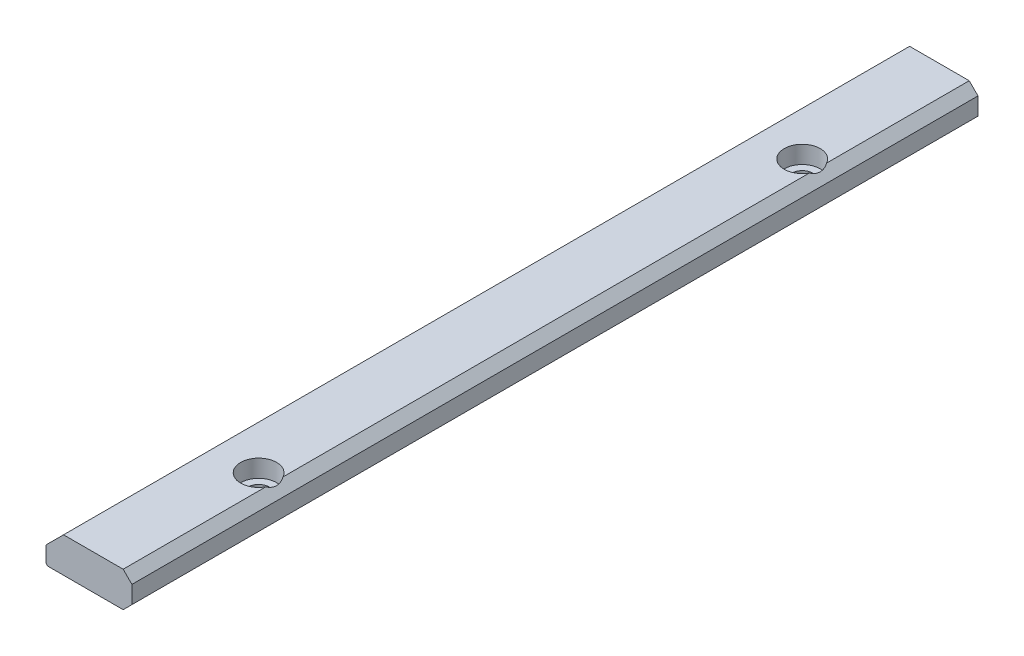
ISO-10303-21;
HEADER;
FILE_DESCRIPTION(('STEP AP214'),'2;1');
FILE_NAME('part.step','',(''),(''),'','','');
FILE_SCHEMA(('AUTOMOTIVE_DESIGN { 1 0 10303 214 1 1 1 1 }'));
ENDSEC;
DATA;
#1=APPLICATION_CONTEXT('core data for automotive mechanical design processes');
#2=APPLICATION_PROTOCOL_DEFINITION('international standard','automotive_design',2000,#1);
#3=PRODUCT_CONTEXT('',#1,'mechanical');
#4=PRODUCT('Part','Part','',(#3));
#5=PRODUCT_RELATED_PRODUCT_CATEGORY('part','',(#4));
#6=PRODUCT_DEFINITION_FORMATION('','',#4);
#7=PRODUCT_DEFINITION_CONTEXT('part definition',#1,'design');
#8=PRODUCT_DEFINITION('design','',#6,#7);
#9=PRODUCT_DEFINITION_SHAPE('','',#8);
#10=(LENGTH_UNIT() NAMED_UNIT(*) SI_UNIT(.MILLI.,.METRE.));
#11=(NAMED_UNIT(*) PLANE_ANGLE_UNIT() SI_UNIT($,.RADIAN.));
#12=(NAMED_UNIT(*) SI_UNIT($,.STERADIAN.) SOLID_ANGLE_UNIT());
#13=UNCERTAINTY_MEASURE_WITH_UNIT(LENGTH_MEASURE(1.E-05),#10,'distance_accuracy_value','');
#14=(GEOMETRIC_REPRESENTATION_CONTEXT(3) GLOBAL_UNCERTAINTY_ASSIGNED_CONTEXT((#13)) GLOBAL_UNIT_ASSIGNED_CONTEXT((#10,
#11,#12)) REPRESENTATION_CONTEXT('',''));
#15=CARTESIAN_POINT('',(0.,0.,0.));
#16=DIRECTION('',(0.,0.,1.));
#17=DIRECTION('',(1.,0.,0.));
#18=AXIS2_PLACEMENT_3D('',#15,#16,#17);
#19=CARTESIAN_POINT('',(0.,0.,-96.5));
#20=DIRECTION('',(0.,0.,-1.));
#21=DIRECTION('',(-1.,0.,0.));
#22=AXIS2_PLACEMENT_3D('',#19,#20,#21);
#23=PLANE('',#22);
#24=DIRECTION('',(1.,0.,0.));
#25=VECTOR('',#24,1.);
#26=CARTESIAN_POINT('',(0.,0.,-96.5));
#27=LINE('',#26,#25);
#28=CARTESIAN_POINT('',(-1.60000000000001,0.,-96.5));
#29=VERTEX_POINT('',#28);
#30=CARTESIAN_POINT('',(6.99999999999997,0.,-96.5));
#31=VERTEX_POINT('',#30);
#32=EDGE_CURVE('E377',#29,#31,#27,.T.);
#33=ORIENTED_EDGE('',*,*,#32,.F.);
#34=DIRECTION('',(0.707106781186548,-0.707106781186548,0.));
#35=VECTOR('',#34,1.);
#36=CARTESIAN_POINT('',(-0.800000000000004,-0.800000000000004,-96.5));
#37=LINE('',#36,#35);
#38=CARTESIAN_POINT('',(-1.8,0.199999999999992,-96.5));
#39=VERTEX_POINT('',#38);
#40=EDGE_CURVE('E283',#29,#39,#37,.F.);
#41=ORIENTED_EDGE('',*,*,#40,.T.);
#42=DIRECTION('',(0.,-1.,0.));
#43=VECTOR('',#42,1.);
#44=CARTESIAN_POINT('',(-1.8,4.,-96.5));
#45=LINE('',#44,#43);
#46=CARTESIAN_POINT('',(-1.8,2.,-96.5));
#47=VERTEX_POINT('',#46);
#48=EDGE_CURVE('E399',#47,#39,#45,.T.);
#49=ORIENTED_EDGE('',*,*,#48,.F.);
#50=DIRECTION('',(-0.707106781186545,-0.70710678118655,0.));
#51=VECTOR('',#50,1.);
#52=CARTESIAN_POINT('',(-1.90000000000001,1.89999999999999,-96.5));
#53=LINE('',#52,#51);
#54=CARTESIAN_POINT('',(0.199999999999988,4.,-96.5));
#55=VERTEX_POINT('',#54);
#56=EDGE_CURVE('E241',#47,#55,#53,.F.);
#57=ORIENTED_EDGE('',*,*,#56,.T.);
#58=DIRECTION('',(-1.,0.,0.));
#59=VECTOR('',#58,1.);
#60=CARTESIAN_POINT('',(0.,4.,-96.5));
#61=LINE('',#60,#59);
#62=CARTESIAN_POINT('',(6.99999999999997,4.,-96.5));
#63=VERTEX_POINT('',#62);
#64=EDGE_CURVE('E391',#63,#55,#61,.T.);
#65=ORIENTED_EDGE('',*,*,#64,.F.);
#66=DIRECTION('',(-0.707106781186548,0.707106781186548,0.));
#67=VECTOR('',#66,1.);
#68=CARTESIAN_POINT('',(5.49999999999999,5.49999999999999,-96.5));
#69=LINE('',#68,#67);
#70=CARTESIAN_POINT('',(8.,2.99999999999997,-96.5));
#71=VERTEX_POINT('',#70);
#72=EDGE_CURVE('E196',#63,#71,#69,.F.);
#73=ORIENTED_EDGE('',*,*,#72,.T.);
#74=DIRECTION('',(0.,1.,0.));
#75=VECTOR('',#74,1.);
#76=CARTESIAN_POINT('',(8.,0.,-96.5));
#77=LINE('',#76,#75);
#78=CARTESIAN_POINT('',(8.,1.00000000000003,-96.5));
#79=VERTEX_POINT('',#78);
#80=EDGE_CURVE('E387',#79,#71,#77,.T.);
#81=ORIENTED_EDGE('',*,*,#80,.F.);
#82=DIRECTION('',(0.707106781186548,0.707106781186548,0.));
#83=VECTOR('',#82,1.);
#84=CARTESIAN_POINT('',(3.49999999999999,-3.49999999999999,-96.5));
#85=LINE('',#84,#83);
#86=EDGE_CURVE('E385',#79,#31,#85,.F.);
#87=ORIENTED_EDGE('',*,*,#86,.T.);
#88=EDGE_LOOP('',(#33,#41,#49,#57,#65,#73,#81,#87));
#89=FACE_BOUND('',#88,.T.);
#90=ADVANCED_FACE('F37',(#89),#23,.T.);
#91=CARTESIAN_POINT('',(0.,0.,0.));
#92=DIRECTION('',(0.,0.,-1.));
#93=DIRECTION('',(-1.,0.,0.));
#94=AXIS2_PLACEMENT_3D('',#91,#92,#93);
#95=PLANE('',#94);
#96=DIRECTION('',(0.,-1.,0.));
#97=VECTOR('',#96,1.);
#98=CARTESIAN_POINT('',(-1.8,4.,0.));
#99=LINE('',#98,#97);
#100=CARTESIAN_POINT('',(-1.8,2.,0.));
#101=VERTEX_POINT('',#100);
#102=CARTESIAN_POINT('',(-1.8,0.199999999999992,0.));
#103=VERTEX_POINT('',#102);
#104=EDGE_CURVE('E388',#101,#103,#99,.T.);
#105=ORIENTED_EDGE('',*,*,#104,.T.);
#106=DIRECTION('',(-0.707106781186548,0.707106781186548,0.));
#107=VECTOR('',#106,1.);
#108=CARTESIAN_POINT('',(-1.8,0.199999999999992,0.));
#109=LINE('',#108,#107);
#110=CARTESIAN_POINT('',(-1.60000000000001,0.,0.));
#111=VERTEX_POINT('',#110);
#112=EDGE_CURVE('E285',#103,#111,#109,.F.);
#113=ORIENTED_EDGE('',*,*,#112,.T.);
#114=DIRECTION('',(1.,0.,0.));
#115=VECTOR('',#114,1.);
#116=CARTESIAN_POINT('',(0.,0.,0.));
#117=LINE('',#116,#115);
#118=CARTESIAN_POINT('',(6.99999999999997,0.,0.));
#119=VERTEX_POINT('',#118);
#120=EDGE_CURVE('E226',#111,#119,#117,.T.);
#121=ORIENTED_EDGE('',*,*,#120,.T.);
#122=DIRECTION('',(-0.707106781186548,-0.707106781186548,0.));
#123=VECTOR('',#122,1.);
#124=CARTESIAN_POINT('',(6.99999999999997,0.,0.));
#125=LINE('',#124,#123);
#126=CARTESIAN_POINT('',(8.,1.00000000000003,0.));
#127=VERTEX_POINT('',#126);
#128=EDGE_CURVE('E410',#119,#127,#125,.F.);
#129=ORIENTED_EDGE('',*,*,#128,.T.);
#130=DIRECTION('',(0.,1.,0.));
#131=VECTOR('',#130,1.);
#132=CARTESIAN_POINT('',(8.,0.,0.));
#133=LINE('',#132,#131);
#134=CARTESIAN_POINT('',(8.,2.99999999999997,0.));
#135=VERTEX_POINT('',#134);
#136=EDGE_CURVE('E402',#127,#135,#133,.T.);
#137=ORIENTED_EDGE('',*,*,#136,.T.);
#138=DIRECTION('',(0.707106781186548,-0.707106781186548,0.));
#139=VECTOR('',#138,1.);
#140=CARTESIAN_POINT('',(8.,2.99999999999997,0.));
#141=LINE('',#140,#139);
#142=CARTESIAN_POINT('',(6.99999999999997,4.,0.));
#143=VERTEX_POINT('',#142);
#144=EDGE_CURVE('E214',#135,#143,#141,.F.);
#145=ORIENTED_EDGE('',*,*,#144,.T.);
#146=DIRECTION('',(-1.,0.,0.));
#147=VECTOR('',#146,1.);
#148=CARTESIAN_POINT('',(0.,4.,0.));
#149=LINE('',#148,#147);
#150=CARTESIAN_POINT('',(0.199999999999988,4.,0.));
#151=VERTEX_POINT('',#150);
#152=EDGE_CURVE('E394',#143,#151,#149,.T.);
#153=ORIENTED_EDGE('',*,*,#152,.T.);
#154=DIRECTION('',(0.707106781186545,0.70710678118655,0.));
#155=VECTOR('',#154,1.);
#156=CARTESIAN_POINT('',(0.199999999999988,4.,0.));
#157=LINE('',#156,#155);
#158=EDGE_CURVE('E237',#151,#101,#157,.F.);
#159=ORIENTED_EDGE('',*,*,#158,.T.);
#160=EDGE_LOOP('',(#105,#113,#121,#129,#137,#145,#153,#159));
#161=FACE_BOUND('',#160,.T.);
#162=ADVANCED_FACE('F420',(#161),#95,.F.);
#163=CARTESIAN_POINT('',(5.20000000000001,4.000012,-79.25));
#164=DIRECTION('',(0.,-1.,0.));
#165=DIRECTION('',(0.,0.,-1.));
#166=AXIS2_PLACEMENT_3D('',#163,#164,#165);
#167=CYLINDRICAL_SURFACE('',#166,1.20000000000001);
#168=CARTESIAN_POINT('',(5.20000000000001,0.,-79.25));
#169=DIRECTION('',(0.,-1.,0.));
#170=DIRECTION('',(0.,0.,-1.));
#171=AXIS2_PLACEMENT_3D('',#168,#169,#170);
#172=CIRCLE('',#171,1.20000000000001);
#173=CARTESIAN_POINT('',(5.20000000000001,0.,-80.45));
#174=VERTEX_POINT('',#173);
#175=EDGE_CURVE('E219',#174,#174,#172,.F.);
#176=CARTESIAN_POINT('',(5.20000000000001,2.,-79.25));
#177=DIRECTION('',(0.,1.,0.));
#178=DIRECTION('',(0.,0.,1.));
#179=AXIS2_PLACEMENT_3D('',#176,#177,#178);
#180=CIRCLE('',#179,1.20000000000001);
#181=CARTESIAN_POINT('',(5.20000000000001,2.,-80.45));
#182=VERTEX_POINT('',#181);
#183=EDGE_CURVE('E223',#182,#182,#180,.T.);
#184=CARTESIAN_POINT('',(5.20000000000001,0.,-80.45));
#185=CARTESIAN_POINT('',(5.20000000000001,0.0208333333333334,-80.45));
#186=CARTESIAN_POINT('',(5.20000000000001,0.0416666666666667,-80.45));
#187=CARTESIAN_POINT('',(5.20000000000001,0.0833333333333333,-80.45));
#188=CARTESIAN_POINT('',(5.20000000000001,0.104166666666666,-80.45));
#189=CARTESIAN_POINT('',(5.20000000000001,0.145833333333333,-80.45));
#190=CARTESIAN_POINT('',(5.20000000000001,0.166666666666666,-80.45));
#191=CARTESIAN_POINT('',(5.20000000000001,0.208333333333333,-80.45));
#192=CARTESIAN_POINT('',(5.20000000000001,0.229166666666666,-80.45));
#193=CARTESIAN_POINT('',(5.20000000000001,0.270833333333333,-80.45));
#194=CARTESIAN_POINT('',(5.20000000000001,0.291666666666666,-80.45));
#195=CARTESIAN_POINT('',(5.20000000000001,0.333333333333333,-80.45));
#196=CARTESIAN_POINT('',(5.20000000000001,0.354166666666666,-80.45));
#197=CARTESIAN_POINT('',(5.20000000000001,0.395833333333333,-80.45));
#198=CARTESIAN_POINT('',(5.20000000000001,0.416666666666666,-80.45));
#199=CARTESIAN_POINT('',(5.20000000000001,0.458333333333333,-80.45));
#200=CARTESIAN_POINT('',(5.20000000000001,0.479166666666666,-80.45));
#201=CARTESIAN_POINT('',(5.20000000000001,0.520833333333333,-80.45));
#202=CARTESIAN_POINT('',(5.20000000000001,0.541666666666666,-80.45));
#203=CARTESIAN_POINT('',(5.20000000000001,0.583333333333333,-80.45));
#204=CARTESIAN_POINT('',(5.20000000000001,0.604166666666666,-80.45));
#205=CARTESIAN_POINT('',(5.20000000000001,0.645833333333333,-80.45));
#206=CARTESIAN_POINT('',(5.20000000000001,0.666666666666666,-80.45));
#207=CARTESIAN_POINT('',(5.20000000000001,0.708333333333333,-80.45));
#208=CARTESIAN_POINT('',(5.20000000000001,0.729166666666666,-80.45));
#209=CARTESIAN_POINT('',(5.20000000000001,0.770833333333333,-80.45));
#210=CARTESIAN_POINT('',(5.20000000000001,0.791666666666666,-80.45));
#211=CARTESIAN_POINT('',(5.20000000000001,0.833333333333333,-80.45));
#212=CARTESIAN_POINT('',(5.20000000000001,0.854166666666666,-80.45));
#213=CARTESIAN_POINT('',(5.20000000000001,0.895833333333333,-80.45));
#214=CARTESIAN_POINT('',(5.20000000000001,0.916666666666666,-80.45));
#215=CARTESIAN_POINT('',(5.20000000000001,0.958333333333333,-80.45));
#216=CARTESIAN_POINT('',(5.20000000000001,0.979166666666666,-80.45));
#217=CARTESIAN_POINT('',(5.20000000000001,1.02083333333333,-80.45));
#218=CARTESIAN_POINT('',(5.20000000000001,1.04166666666667,-80.45));
#219=CARTESIAN_POINT('',(5.20000000000001,1.08333333333333,-80.45));
#220=CARTESIAN_POINT('',(5.20000000000001,1.10416666666667,-80.45));
#221=CARTESIAN_POINT('',(5.20000000000001,1.14583333333333,-80.45));
#222=CARTESIAN_POINT('',(5.20000000000001,1.16666666666667,-80.45));
#223=CARTESIAN_POINT('',(5.20000000000001,1.20833333333333,-80.45));
#224=CARTESIAN_POINT('',(5.20000000000001,1.22916666666667,-80.45));
#225=CARTESIAN_POINT('',(5.20000000000001,1.27083333333333,-80.45));
#226=CARTESIAN_POINT('',(5.20000000000001,1.29166666666667,-80.45));
#227=CARTESIAN_POINT('',(5.20000000000001,1.33333333333333,-80.45));
#228=CARTESIAN_POINT('',(5.20000000000001,1.35416666666667,-80.45));
#229=CARTESIAN_POINT('',(5.20000000000001,1.39583333333333,-80.45));
#230=CARTESIAN_POINT('',(5.20000000000001,1.41666666666667,-80.45));
#231=CARTESIAN_POINT('',(5.20000000000001,1.45833333333333,-80.45));
#232=CARTESIAN_POINT('',(5.20000000000001,1.47916666666667,-80.45));
#233=CARTESIAN_POINT('',(5.20000000000001,1.52083333333333,-80.45));
#234=CARTESIAN_POINT('',(5.20000000000001,1.54166666666667,-80.45));
#235=CARTESIAN_POINT('',(5.20000000000001,1.58333333333333,-80.45));
#236=CARTESIAN_POINT('',(5.20000000000001,1.60416666666667,-80.45));
#237=CARTESIAN_POINT('',(5.20000000000001,1.64583333333333,-80.45));
#238=CARTESIAN_POINT('',(5.20000000000001,1.66666666666667,-80.45));
#239=CARTESIAN_POINT('',(5.20000000000001,1.70833333333333,-80.45));
#240=CARTESIAN_POINT('',(5.20000000000001,1.72916666666667,-80.45));
#241=CARTESIAN_POINT('',(5.20000000000001,1.77083333333333,-80.45));
#242=CARTESIAN_POINT('',(5.20000000000001,1.79166666666667,-80.45));
#243=CARTESIAN_POINT('',(5.20000000000001,1.83333333333333,-80.45));
#244=CARTESIAN_POINT('',(5.20000000000001,1.85416666666667,-80.45));
#245=CARTESIAN_POINT('',(5.20000000000001,1.89583333333333,-80.45));
#246=CARTESIAN_POINT('',(5.20000000000001,1.91666666666667,-80.45));
#247=CARTESIAN_POINT('',(5.20000000000001,1.95833333333333,-80.45));
#248=CARTESIAN_POINT('',(5.20000000000001,1.97916666666667,-80.45));
#249=CARTESIAN_POINT('',(5.20000000000001,2.,-80.45));
#250=B_SPLINE_CURVE_WITH_KNOTS('',3,(#184,#185,#186,#187,#188,#189,#190,#191,#192,#193,#194,
#195,#196,#197,#198,#199,#200,#201,#202,#203,#204,#205,#206,#207,#208,#209,#210,#211,#212,#213,
#214,#215,#216,#217,#218,#219,#220,#221,#222,#223,#224,#225,#226,#227,#228,#229,#230,#231,#232,
#233,#234,#235,#236,#237,#238,#239,#240,#241,#242,#243,#244,#245,#246,#247,#248,#249),
.UNSPECIFIED.,.F.,.F.,(4,2,2,2,2,2,2,2,2,2,2,2,2,2,2,2,2,2,2,2,2,2,2,2,2,2,2,2,2,2,2,2,4),(0.,
0.0625000000000001,0.125,0.1875,0.25,0.312499999999999,0.374999999999999,0.4375,0.5,0.5625,
0.625,0.687499999999999,0.749999999999999,0.812499999999999,0.874999999999999,0.9375,1.,1.0625,
1.125,1.1875,1.25,1.3125,1.375,1.4375,1.5,1.5625,1.625,1.6875,1.75,1.8125,1.875,1.9375,2.),.UNSPECIFIED.);
#251=EDGE_CURVE('BSEAM460',#174,#182,#250,.T.);
#252=ORIENTED_EDGE('',*,*,#175,.F.);
#253=ORIENTED_EDGE('',*,*,#183,.T.);
#254=ORIENTED_EDGE('',*,*,#251,.T.);
#255=ORIENTED_EDGE('',*,*,#251,.F.);
#256=EDGE_LOOP('',(#252,#254,#253,#255));
#257=FACE_BOUND('',#256,.T.);
#258=ADVANCED_FACE('F460',(#257),#167,.F.);
#259=CARTESIAN_POINT('',(5.20000000000001,4.000012,-17.25));
#260=DIRECTION('',(0.,-1.,0.));
#261=DIRECTION('',(0.,0.,-1.));
#262=AXIS2_PLACEMENT_3D('',#259,#260,#261);
#263=CYLINDRICAL_SURFACE('',#262,1.2);
#264=CARTESIAN_POINT('',(5.20000000000001,0.,-17.25));
#265=DIRECTION('',(0.,-1.,0.));
#266=DIRECTION('',(0.,0.,-1.));
#267=AXIS2_PLACEMENT_3D('',#264,#265,#266);
#268=CIRCLE('',#267,1.2);
#269=CARTESIAN_POINT('',(5.20000000000001,0.,-18.45));
#270=VERTEX_POINT('',#269);
#271=EDGE_CURVE('E222',#270,#270,#268,.F.);
#272=CARTESIAN_POINT('',(5.20000000000001,2.,-17.25));
#273=DIRECTION('',(0.,1.,0.));
#274=DIRECTION('',(0.,0.,1.));
#275=AXIS2_PLACEMENT_3D('',#272,#273,#274);
#276=CIRCLE('',#275,1.2);
#277=CARTESIAN_POINT('',(5.20000000000001,2.,-18.45));
#278=VERTEX_POINT('',#277);
#279=EDGE_CURVE('E227',#278,#278,#276,.T.);
#280=CARTESIAN_POINT('',(5.20000000000001,0.,-18.45));
#281=CARTESIAN_POINT('',(5.20000000000001,0.0208333333333334,-18.45));
#282=CARTESIAN_POINT('',(5.20000000000001,0.0416666666666667,-18.45));
#283=CARTESIAN_POINT('',(5.20000000000001,0.0833333333333333,-18.45));
#284=CARTESIAN_POINT('',(5.20000000000001,0.104166666666666,-18.45));
#285=CARTESIAN_POINT('',(5.20000000000001,0.145833333333333,-18.45));
#286=CARTESIAN_POINT('',(5.20000000000001,0.166666666666666,-18.45));
#287=CARTESIAN_POINT('',(5.20000000000001,0.208333333333333,-18.45));
#288=CARTESIAN_POINT('',(5.20000000000001,0.229166666666666,-18.45));
#289=CARTESIAN_POINT('',(5.20000000000001,0.270833333333333,-18.45));
#290=CARTESIAN_POINT('',(5.20000000000001,0.291666666666666,-18.45));
#291=CARTESIAN_POINT('',(5.20000000000001,0.333333333333333,-18.45));
#292=CARTESIAN_POINT('',(5.20000000000001,0.354166666666666,-18.45));
#293=CARTESIAN_POINT('',(5.20000000000001,0.395833333333333,-18.45));
#294=CARTESIAN_POINT('',(5.20000000000001,0.416666666666666,-18.45));
#295=CARTESIAN_POINT('',(5.20000000000001,0.458333333333333,-18.45));
#296=CARTESIAN_POINT('',(5.20000000000001,0.479166666666666,-18.45));
#297=CARTESIAN_POINT('',(5.20000000000001,0.520833333333333,-18.45));
#298=CARTESIAN_POINT('',(5.20000000000001,0.541666666666666,-18.45));
#299=CARTESIAN_POINT('',(5.20000000000001,0.583333333333333,-18.45));
#300=CARTESIAN_POINT('',(5.20000000000001,0.604166666666666,-18.45));
#301=CARTESIAN_POINT('',(5.20000000000001,0.645833333333333,-18.45));
#302=CARTESIAN_POINT('',(5.20000000000001,0.666666666666666,-18.45));
#303=CARTESIAN_POINT('',(5.20000000000001,0.708333333333333,-18.45));
#304=CARTESIAN_POINT('',(5.20000000000001,0.729166666666666,-18.45));
#305=CARTESIAN_POINT('',(5.20000000000001,0.770833333333333,-18.45));
#306=CARTESIAN_POINT('',(5.20000000000001,0.791666666666666,-18.45));
#307=CARTESIAN_POINT('',(5.20000000000001,0.833333333333333,-18.45));
#308=CARTESIAN_POINT('',(5.20000000000001,0.854166666666666,-18.45));
#309=CARTESIAN_POINT('',(5.20000000000001,0.895833333333333,-18.45));
#310=CARTESIAN_POINT('',(5.20000000000001,0.916666666666666,-18.45));
#311=CARTESIAN_POINT('',(5.20000000000001,0.958333333333333,-18.45));
#312=CARTESIAN_POINT('',(5.20000000000001,0.979166666666666,-18.45));
#313=CARTESIAN_POINT('',(5.20000000000001,1.02083333333333,-18.45));
#314=CARTESIAN_POINT('',(5.20000000000001,1.04166666666667,-18.45));
#315=CARTESIAN_POINT('',(5.20000000000001,1.08333333333333,-18.45));
#316=CARTESIAN_POINT('',(5.20000000000001,1.10416666666667,-18.45));
#317=CARTESIAN_POINT('',(5.20000000000001,1.14583333333333,-18.45));
#318=CARTESIAN_POINT('',(5.20000000000001,1.16666666666667,-18.45));
#319=CARTESIAN_POINT('',(5.20000000000001,1.20833333333333,-18.45));
#320=CARTESIAN_POINT('',(5.20000000000001,1.22916666666667,-18.45));
#321=CARTESIAN_POINT('',(5.20000000000001,1.27083333333333,-18.45));
#322=CARTESIAN_POINT('',(5.20000000000001,1.29166666666667,-18.45));
#323=CARTESIAN_POINT('',(5.20000000000001,1.33333333333333,-18.45));
#324=CARTESIAN_POINT('',(5.20000000000001,1.35416666666667,-18.45));
#325=CARTESIAN_POINT('',(5.20000000000001,1.39583333333333,-18.45));
#326=CARTESIAN_POINT('',(5.20000000000001,1.41666666666667,-18.45));
#327=CARTESIAN_POINT('',(5.20000000000001,1.45833333333333,-18.45));
#328=CARTESIAN_POINT('',(5.20000000000001,1.47916666666667,-18.45));
#329=CARTESIAN_POINT('',(5.20000000000001,1.52083333333333,-18.45));
#330=CARTESIAN_POINT('',(5.20000000000001,1.54166666666667,-18.45));
#331=CARTESIAN_POINT('',(5.20000000000001,1.58333333333333,-18.45));
#332=CARTESIAN_POINT('',(5.20000000000001,1.60416666666667,-18.45));
#333=CARTESIAN_POINT('',(5.20000000000001,1.64583333333333,-18.45));
#334=CARTESIAN_POINT('',(5.20000000000001,1.66666666666667,-18.45));
#335=CARTESIAN_POINT('',(5.20000000000001,1.70833333333333,-18.45));
#336=CARTESIAN_POINT('',(5.20000000000001,1.72916666666667,-18.45));
#337=CARTESIAN_POINT('',(5.20000000000001,1.77083333333333,-18.45));
#338=CARTESIAN_POINT('',(5.20000000000001,1.79166666666667,-18.45));
#339=CARTESIAN_POINT('',(5.20000000000001,1.83333333333333,-18.45));
#340=CARTESIAN_POINT('',(5.20000000000001,1.85416666666667,-18.45));
#341=CARTESIAN_POINT('',(5.20000000000001,1.89583333333333,-18.45));
#342=CARTESIAN_POINT('',(5.20000000000001,1.91666666666667,-18.45));
#343=CARTESIAN_POINT('',(5.20000000000001,1.95833333333333,-18.45));
#344=CARTESIAN_POINT('',(5.20000000000001,1.97916666666667,-18.45));
#345=CARTESIAN_POINT('',(5.20000000000001,2.,-18.45));
#346=B_SPLINE_CURVE_WITH_KNOTS('',3,(#280,#281,#282,#283,#284,#285,#286,#287,#288,#289,#290,
#291,#292,#293,#294,#295,#296,#297,#298,#299,#300,#301,#302,#303,#304,#305,#306,#307,#308,#309,
#310,#311,#312,#313,#314,#315,#316,#317,#318,#319,#320,#321,#322,#323,#324,#325,#326,#327,#328,
#329,#330,#331,#332,#333,#334,#335,#336,#337,#338,#339,#340,#341,#342,#343,#344,#345),
.UNSPECIFIED.,.F.,.F.,(4,2,2,2,2,2,2,2,2,2,2,2,2,2,2,2,2,2,2,2,2,2,2,2,2,2,2,2,2,2,2,2,4),(0.,
0.0625000000000001,0.125,0.1875,0.25,0.312499999999999,0.374999999999999,0.4375,0.5,0.5625,
0.625,0.687499999999999,0.749999999999999,0.812499999999999,0.874999999999999,0.9375,1.,1.0625,
1.125,1.1875,1.25,1.3125,1.375,1.4375,1.5,1.5625,1.625,1.6875,1.75,1.8125,1.875,1.9375,2.),.UNSPECIFIED.);
#347=EDGE_CURVE('BSEAM480',#270,#278,#346,.T.);
#348=ORIENTED_EDGE('',*,*,#271,.F.);
#349=ORIENTED_EDGE('',*,*,#279,.T.);
#350=ORIENTED_EDGE('',*,*,#347,.T.);
#351=ORIENTED_EDGE('',*,*,#347,.F.);
#352=EDGE_LOOP('',(#348,#350,#349,#351));
#353=FACE_BOUND('',#352,.T.);
#354=ADVANCED_FACE('F480',(#353),#263,.F.);
#355=CARTESIAN_POINT('',(0.,0.,-96.5));
#356=DIRECTION('',(1.,0.,0.));
#357=DIRECTION('',(0.,1.,0.));
#358=AXIS2_PLACEMENT_3D('',#355,#356,#357);
#359=PLANE('',#358);
#360=DIRECTION('',(0.,0.,-1.));
#361=VECTOR('',#360,1.);
#362=CARTESIAN_POINT('',(0.,-1.70000000000001,-96.5));
#363=LINE('',#362,#361);
#364=CARTESIAN_POINT('',(0.,-1.70000000000001,-7.80000000000001));
#365=VERTEX_POINT('',#364);
#366=CARTESIAN_POINT('',(0.,-1.70000000000001,-88.7));
#367=VERTEX_POINT('',#366);
#368=EDGE_CURVE('E248',#365,#367,#363,.T.);
#369=ORIENTED_EDGE('',*,*,#368,.T.);
#370=DIRECTION('',(0.,0.707106781186539,-0.707106781186556));
#371=VECTOR('',#370,1.);
#372=CARTESIAN_POINT('',(0.,3.04999999999998,-93.4500000000001));
#373=LINE('',#372,#371);
#374=CARTESIAN_POINT('',(0.,-1.5,-88.9));
#375=VERTEX_POINT('',#374);
#376=EDGE_CURVE('E320',#367,#375,#373,.T.);
#377=ORIENTED_EDGE('',*,*,#376,.T.);
#378=DIRECTION('',(0.,1.,0.));
#379=VECTOR('',#378,1.);
#380=CARTESIAN_POINT('',(0.,0.,-88.9));
#381=LINE('',#380,#379);
#382=CARTESIAN_POINT('',(0.,0.,-88.9));
#383=VERTEX_POINT('',#382);
#384=EDGE_CURVE('E254',#375,#383,#381,.T.);
#385=ORIENTED_EDGE('',*,*,#384,.T.);
#386=DIRECTION('',(0.,0.,1.));
#387=VECTOR('',#386,1.);
#388=CARTESIAN_POINT('',(0.,0.,-96.5));
#389=LINE('',#388,#387);
#390=CARTESIAN_POINT('',(0.,0.,-7.6));
#391=VERTEX_POINT('',#390);
#392=EDGE_CURVE('E335',#383,#391,#389,.T.);
#393=ORIENTED_EDGE('',*,*,#392,.T.);
#394=DIRECTION('',(0.,-1.,0.));
#395=VECTOR('',#394,1.);
#396=CARTESIAN_POINT('',(0.,-1.9,-7.6));
#397=LINE('',#396,#395);
#398=CARTESIAN_POINT('',(0.,-1.5,-7.6));
#399=VERTEX_POINT('',#398);
#400=EDGE_CURVE('E251',#391,#399,#397,.T.);
#401=ORIENTED_EDGE('',*,*,#400,.T.);
#402=DIRECTION('',(0.,-0.707106781186539,-0.707106781186556));
#403=VECTOR('',#402,1.);
#404=CARTESIAN_POINT('',(0.,-45.2,-51.3000000000011));
#405=LINE('',#404,#403);
#406=EDGE_CURVE('E318',#399,#365,#405,.T.);
#407=ORIENTED_EDGE('',*,*,#406,.T.);
#408=EDGE_LOOP('',(#369,#377,#385,#393,#401,#407));
#409=FACE_BOUND('',#408,.T.);
#410=ADVANCED_FACE('F332',(#409),#359,.T.);
#411=CARTESIAN_POINT('',(0.,-1.9,-96.5));
#412=DIRECTION('',(0.,-1.,0.));
#413=DIRECTION('',(1.,0.,0.));
#414=AXIS2_PLACEMENT_3D('',#411,#412,#413);
#415=PLANE('',#414);
#416=DIRECTION('',(0.,0.,-1.));
#417=VECTOR('',#416,1.);
#418=CARTESIAN_POINT('',(-1.60000000000001,-1.9,-96.5));
#419=LINE('',#418,#417);
#420=CARTESIAN_POINT('',(-1.60000000000001,-1.9,-8.00000000000001));
#421=VERTEX_POINT('',#420);
#422=CARTESIAN_POINT('',(-1.60000000000001,-1.9,-88.5));
#423=VERTEX_POINT('',#422);
#424=EDGE_CURVE('E260',#421,#423,#419,.T.);
#425=ORIENTED_EDGE('',*,*,#424,.T.);
#426=DIRECTION('',(1.,0.,0.));
#427=VECTOR('',#426,1.);
#428=CARTESIAN_POINT('',(-0.199999999999992,-1.9,-88.5));
#429=LINE('',#428,#427);
#430=CARTESIAN_POINT('',(-0.199999999999992,-1.9,-88.5));
#431=VERTEX_POINT('',#430);
#432=EDGE_CURVE('E312',#423,#431,#429,.T.);
#433=ORIENTED_EDGE('',*,*,#432,.T.);
#434=DIRECTION('',(0.,0.,1.));
#435=VECTOR('',#434,1.);
#436=CARTESIAN_POINT('',(-0.199999999999992,-1.9,-96.5));
#437=LINE('',#436,#435);
#438=CARTESIAN_POINT('',(-0.199999999999992,-1.9,-8.00000000000001));
#439=VERTEX_POINT('',#438);
#440=EDGE_CURVE('E263',#431,#439,#437,.T.);
#441=ORIENTED_EDGE('',*,*,#440,.T.);
#442=DIRECTION('',(-1.,0.,0.));
#443=VECTOR('',#442,1.);
#444=CARTESIAN_POINT('',(-1.60000000000001,-1.9,-8.00000000000001));
#445=LINE('',#444,#443);
#446=EDGE_CURVE('E310',#439,#421,#445,.T.);
#447=ORIENTED_EDGE('',*,*,#446,.T.);
#448=EDGE_LOOP('',(#425,#433,#441,#447));
#449=FACE_BOUND('',#448,.T.);
#450=ADVANCED_FACE('F344',(#449),#415,.T.);
#451=CARTESIAN_POINT('',(-1.8,4.,-96.5));
#452=DIRECTION('',(-1.,0.,0.));
#453=DIRECTION('',(0.,-1.,0.));
#454=AXIS2_PLACEMENT_3D('',#451,#452,#453);
#455=PLANE('',#454);
#456=DIRECTION('',(0.,-1.,0.));
#457=VECTOR('',#456,1.);
#458=CARTESIAN_POINT('',(-1.8,-1.9,-88.9));
#459=LINE('',#458,#457);
#460=CARTESIAN_POINT('',(-1.8,0.199999999999992,-88.9));
#461=VERTEX_POINT('',#460);
#462=CARTESIAN_POINT('',(-1.8,-1.5,-88.9));
#463=VERTEX_POINT('',#462);
#464=EDGE_CURVE('E273',#461,#463,#459,.T.);
#465=ORIENTED_EDGE('',*,*,#464,.T.);
#466=DIRECTION('',(0.,-0.707106781186539,0.707106781186556));
#467=VECTOR('',#466,1.);
#468=CARTESIAN_POINT('',(-1.8,5.04999999999993,-95.4500000000001));
#469=LINE('',#468,#467);
#470=CARTESIAN_POINT('',(-1.8,-1.70000000000001,-88.7));
#471=VERTEX_POINT('',#470);
#472=EDGE_CURVE('E304',#463,#471,#469,.T.);
#473=ORIENTED_EDGE('',*,*,#472,.T.);
#474=DIRECTION('',(0.,0.,1.));
#475=VECTOR('',#474,1.);
#476=CARTESIAN_POINT('',(-1.8,-1.70000000000001,-96.5));
#477=LINE('',#476,#475);
#478=CARTESIAN_POINT('',(-1.8,-1.70000000000001,-7.80000000000001));
#479=VERTEX_POINT('',#478);
#480=EDGE_CURVE('E266',#471,#479,#477,.T.);
#481=ORIENTED_EDGE('',*,*,#480,.T.);
#482=DIRECTION('',(0.,0.707106781186539,0.707106781186556));
#483=VECTOR('',#482,1.);
#484=CARTESIAN_POINT('',(-1.8,-43.2000000000001,-49.300000000001));
#485=LINE('',#484,#483);
#486=CARTESIAN_POINT('',(-1.8,-1.5,-7.6));
#487=VERTEX_POINT('',#486);
#488=EDGE_CURVE('E302',#479,#487,#485,.T.);
#489=ORIENTED_EDGE('',*,*,#488,.T.);
#490=DIRECTION('',(0.,1.,0.));
#491=VECTOR('',#490,1.);
#492=CARTESIAN_POINT('',(-1.8,0.,-7.6));
#493=LINE('',#492,#491);
#494=CARTESIAN_POINT('',(-1.8,0.199999999999992,-7.6));
#495=VERTEX_POINT('',#494);
#496=EDGE_CURVE('E269',#487,#495,#493,.T.);
#497=ORIENTED_EDGE('',*,*,#496,.T.);
#498=DIRECTION('',(0.,0.,1.));
#499=VECTOR('',#498,1.);
#500=CARTESIAN_POINT('',(-1.8,0.199999999999992,-96.5));
#501=LINE('',#500,#499);
#502=EDGE_CURVE('E271',#495,#103,#501,.T.);
#503=ORIENTED_EDGE('',*,*,#502,.T.);
#504=ORIENTED_EDGE('',*,*,#104,.F.);
#505=DIRECTION('',(0.,0.,-1.));
#506=VECTOR('',#505,1.);
#507=CARTESIAN_POINT('',(-1.8,2.,-96.5));
#508=LINE('',#507,#506);
#509=EDGE_CURVE('E239',#101,#47,#508,.T.);
#510=ORIENTED_EDGE('',*,*,#509,.T.);
#511=ORIENTED_EDGE('',*,*,#48,.T.);
#512=DIRECTION('',(0.,0.,1.));
#513=VECTOR('',#512,1.);
#514=CARTESIAN_POINT('',(-1.8,0.199999999999992,-96.5));
#515=LINE('',#514,#513);
#516=EDGE_CURVE('E276',#39,#461,#515,.T.);
#517=ORIENTED_EDGE('',*,*,#516,.T.);
#518=EDGE_LOOP('',(#465,#473,#481,#489,#497,#503,#504,#510,#511,#517));
#519=FACE_BOUND('',#518,.T.);
#520=ADVANCED_FACE('F430',(#519),#455,.T.);
#521=CARTESIAN_POINT('',(0.,4.,-96.5));
#522=DIRECTION('',(0.,1.,0.));
#523=DIRECTION('',(0.,0.,1.));
#524=AXIS2_PLACEMENT_3D('',#521,#522,#523);
#525=PLANE('',#524);
#526=ORIENTED_EDGE('',*,*,#64,.T.);
#527=DIRECTION('',(0.,0.,1.));
#528=VECTOR('',#527,1.);
#529=CARTESIAN_POINT('',(0.199999999999988,4.,-96.5));
#530=LINE('',#529,#528);
#531=EDGE_CURVE('E234',#55,#151,#530,.T.);
#532=ORIENTED_EDGE('',*,*,#531,.T.);
#533=ORIENTED_EDGE('',*,*,#152,.F.);
#534=DIRECTION('',(0.,0.,-1.));
#535=VECTOR('',#534,1.);
#536=CARTESIAN_POINT('',(6.99999999999997,4.,-96.5));
#537=LINE('',#536,#535);
#538=CARTESIAN_POINT('',(6.99999999999997,4.,-16.2689291564825));
#539=VERTEX_POINT('',#538);
#540=EDGE_CURVE('E205',#143,#539,#537,.T.);
#541=ORIENTED_EDGE('',*,*,#540,.T.);
#542=CARTESIAN_POINT('',(5.20000000000001,4.,-17.25));
#543=DIRECTION('',(0.,1.,0.));
#544=DIRECTION('',(0.,0.,1.));
#545=AXIS2_PLACEMENT_3D('',#542,#543,#544);
#546=CIRCLE('',#545,2.05);
#547=CARTESIAN_POINT('',(6.99999999999997,4.,-18.2310708435175));
#548=VERTEX_POINT('',#547);
#549=EDGE_CURVE('E190',#548,#539,#546,.T.);
#550=ORIENTED_EDGE('',*,*,#549,.F.);
#551=CARTESIAN_POINT('',(6.99999999999997,4.,-78.2689291564825));
#552=VERTEX_POINT('',#551);
#553=EDGE_CURVE('E203',#548,#552,#537,.T.);
#554=ORIENTED_EDGE('',*,*,#553,.T.);
#555=CARTESIAN_POINT('',(5.20000000000001,4.,-79.25));
#556=DIRECTION('',(0.,1.,0.));
#557=DIRECTION('',(0.,0.,1.));
#558=AXIS2_PLACEMENT_3D('',#555,#556,#557);
#559=CIRCLE('',#558,2.05);
#560=CARTESIAN_POINT('',(6.99999999999997,4.,-80.2310708435175));
#561=VERTEX_POINT('',#560);
#562=EDGE_CURVE('E206',#561,#552,#559,.T.);
#563=ORIENTED_EDGE('',*,*,#562,.F.);
#564=EDGE_CURVE('E212',#561,#63,#537,.T.);
#565=ORIENTED_EDGE('',*,*,#564,.T.);
#566=EDGE_LOOP('',(#526,#532,#533,#541,#550,#554,#563,#565));
#567=FACE_BOUND('',#566,.T.);
#568=ADVANCED_FACE('F201',(#567),#525,.T.);
#569=CARTESIAN_POINT('',(8.,0.,-96.5));
#570=DIRECTION('',(1.,0.,0.));
#571=DIRECTION('',(0.,0.,-1.));
#572=AXIS2_PLACEMENT_3D('',#569,#570,#571);
#573=PLANE('',#572);
#574=ORIENTED_EDGE('',*,*,#80,.T.);
#575=DIRECTION('',(0.,0.,1.));
#576=VECTOR('',#575,1.);
#577=CARTESIAN_POINT('',(8.,2.99999999999997,-96.5));
#578=LINE('',#577,#576);
#579=EDGE_CURVE('E414',#71,#135,#578,.T.);
#580=ORIENTED_EDGE('',*,*,#579,.T.);
#581=ORIENTED_EDGE('',*,*,#136,.F.);
#582=DIRECTION('',(0.,0.,-1.));
#583=VECTOR('',#582,1.);
#584=CARTESIAN_POINT('',(8.,1.00000000000003,-96.5));
#585=LINE('',#584,#583);
#586=EDGE_CURVE('E412',#127,#79,#585,.T.);
#587=ORIENTED_EDGE('',*,*,#586,.T.);
#588=EDGE_LOOP('',(#574,#580,#581,#587));
#589=FACE_BOUND('',#588,.T.);
#590=ADVANCED_FACE('F471',(#589),#573,.T.);
#591=CARTESIAN_POINT('',(0.,0.,-96.5));
#592=DIRECTION('',(0.,-1.,0.));
#593=DIRECTION('',(0.,0.,-1.));
#594=AXIS2_PLACEMENT_3D('',#591,#592,#593);
#595=PLANE('',#594);
#596=ORIENTED_EDGE('',*,*,#271,.T.);
#597=EDGE_LOOP('',(#596));
#598=FACE_BOUND('',#597,.T.);
#599=ORIENTED_EDGE('',*,*,#175,.T.);
#600=EDGE_LOOP('',(#599));
#601=FACE_BOUND('',#600,.T.);
#602=DIRECTION('',(1.,0.,0.));
#603=VECTOR('',#602,1.);
#604=CARTESIAN_POINT('',(-1.8,0.,-89.1));
#605=LINE('',#604,#603);
#606=CARTESIAN_POINT('',(-1.60000000000001,0.,-89.1));
#607=VERTEX_POINT('',#606);
#608=CARTESIAN_POINT('',(-0.199999999999992,0.,-89.1));
#609=VERTEX_POINT('',#608);
#610=EDGE_CURVE('E379',#607,#609,#605,.T.);
#611=ORIENTED_EDGE('',*,*,#610,.F.);
#612=DIRECTION('',(0.,0.,-1.));
#613=VECTOR('',#612,1.);
#614=CARTESIAN_POINT('',(-1.60000000000001,0.,-96.5));
#615=LINE('',#614,#613);
#616=EDGE_CURVE('E281',#607,#29,#615,.T.);
#617=ORIENTED_EDGE('',*,*,#616,.T.);
#618=ORIENTED_EDGE('',*,*,#32,.T.);
#619=DIRECTION('',(0.,0.,1.));
#620=VECTOR('',#619,1.);
#621=CARTESIAN_POINT('',(6.99999999999997,0.,-96.5));
#622=LINE('',#621,#620);
#623=EDGE_CURVE('E408',#31,#119,#622,.T.);
#624=ORIENTED_EDGE('',*,*,#623,.T.);
#625=ORIENTED_EDGE('',*,*,#120,.F.);
#626=DIRECTION('',(0.,0.,-1.));
#627=VECTOR('',#626,1.);
#628=CARTESIAN_POINT('',(-1.60000000000001,0.,-96.5));
#629=LINE('',#628,#627);
#630=CARTESIAN_POINT('',(-1.60000000000001,0.,-7.4));
#631=VERTEX_POINT('',#630);
#632=EDGE_CURVE('E279',#111,#631,#629,.T.);
#633=ORIENTED_EDGE('',*,*,#632,.T.);
#634=DIRECTION('',(-1.,0.,0.));
#635=VECTOR('',#634,1.);
#636=CARTESIAN_POINT('',(-1.8,0.,-7.4));
#637=LINE('',#636,#635);
#638=CARTESIAN_POINT('',(-0.199999999999992,0.,-7.4));
#639=VERTEX_POINT('',#638);
#640=EDGE_CURVE('E297',#639,#631,#637,.T.);
#641=ORIENTED_EDGE('',*,*,#640,.F.);
#642=DIRECTION('',(0.707106781186547,0.,-0.707106781186548));
#643=VECTOR('',#642,1.);
#644=CARTESIAN_POINT('',(0.,0.,-7.6));
#645=LINE('',#644,#643);
#646=EDGE_CURVE('E289',#639,#391,#645,.T.);
#647=ORIENTED_EDGE('',*,*,#646,.T.);
#648=ORIENTED_EDGE('',*,*,#392,.F.);
#649=DIRECTION('',(-0.707106781186547,0.,-0.707106781186548));
#650=VECTOR('',#649,1.);
#651=CARTESIAN_POINT('',(-0.199999999999992,0.,-89.1));
#652=LINE('',#651,#650);
#653=EDGE_CURVE('E287',#383,#609,#652,.T.);
#654=ORIENTED_EDGE('',*,*,#653,.T.);
#655=EDGE_LOOP('',(#611,#617,#618,#624,#625,#633,#641,#647,#648,#654));
#656=FACE_BOUND('',#655,.T.);
#657=ADVANCED_FACE('F375',(#598,#601,#656),#595,.T.);
#658=CARTESIAN_POINT('',(6.99999999999997,0.,-96.5));
#659=DIRECTION('',(-0.707106781186548,0.707106781186548,0.));
#660=DIRECTION('',(0.,0.,1.));
#661=AXIS2_PLACEMENT_3D('',#658,#659,#660);
#662=PLANE('',#661);
#663=ORIENTED_EDGE('',*,*,#86,.F.);
#664=ORIENTED_EDGE('',*,*,#586,.F.);
#665=ORIENTED_EDGE('',*,*,#128,.F.);
#666=ORIENTED_EDGE('',*,*,#623,.F.);
#667=EDGE_LOOP('',(#663,#664,#665,#666));
#668=FACE_BOUND('',#667,.T.);
#669=ADVANCED_FACE('F476',(#668),#662,.F.);
#670=CARTESIAN_POINT('',(8.,2.99999999999997,-96.5));
#671=DIRECTION('',(-0.707106781186548,-0.707106781186548,0.));
#672=DIRECTION('',(0.,0.,1.));
#673=AXIS2_PLACEMENT_3D('',#670,#671,#672);
#674=PLANE('',#673);
#675=CARTESIAN_POINT('',(5.20000000000001,5.79999999999996,-79.25));
#676=DIRECTION('',(-0.707106781186548,-0.707106781186548,0.));
#677=DIRECTION('',(-0.707106781186548,0.707106781186548,0.));
#678=AXIS2_PLACEMENT_3D('',#675,#676,#677);
#679=ELLIPSE('',#678,2.89913780286484,2.05);
#680=EDGE_CURVE('E195',#552,#561,#679,.F.);
#681=ORIENTED_EDGE('',*,*,#680,.F.);
#682=ORIENTED_EDGE('',*,*,#553,.F.);
#683=CARTESIAN_POINT('',(5.20000000000001,5.79999999999996,-17.25));
#684=DIRECTION('',(-0.707106781186548,-0.707106781186548,0.));
#685=DIRECTION('',(-0.707106781186548,0.707106781186548,0.));
#686=AXIS2_PLACEMENT_3D('',#683,#684,#685);
#687=ELLIPSE('',#686,2.89913780286484,2.05);
#688=EDGE_CURVE('E186',#539,#548,#687,.F.);
#689=ORIENTED_EDGE('',*,*,#688,.F.);
#690=ORIENTED_EDGE('',*,*,#540,.F.);
#691=ORIENTED_EDGE('',*,*,#144,.F.);
#692=ORIENTED_EDGE('',*,*,#579,.F.);
#693=ORIENTED_EDGE('',*,*,#72,.F.);
#694=ORIENTED_EDGE('',*,*,#564,.F.);
#695=EDGE_LOOP('',(#681,#682,#689,#690,#691,#692,#693,#694));
#696=FACE_BOUND('',#695,.T.);
#697=ADVANCED_FACE('F210',(#696),#674,.F.);
#698=CARTESIAN_POINT('',(5.20000000000001,2.,-17.25));
#699=DIRECTION('',(0.,1.,0.));
#700=DIRECTION('',(0.,0.,1.));
#701=AXIS2_PLACEMENT_3D('',#698,#699,#700);
#702=CYLINDRICAL_SURFACE('',#701,2.05);
#703=ORIENTED_EDGE('',*,*,#688,.T.);
#704=ORIENTED_EDGE('',*,*,#549,.T.);
#705=EDGE_LOOP('',(#703,#704));
#706=FACE_BOUND('',#705,.T.);
#707=CARTESIAN_POINT('',(5.20000000000001,2.,-17.25));
#708=DIRECTION('',(0.,1.,0.));
#709=DIRECTION('',(0.,0.,1.));
#710=AXIS2_PLACEMENT_3D('',#707,#708,#709);
#711=CIRCLE('',#710,2.05);
#712=CARTESIAN_POINT('',(5.20000000000001,2.,-15.2));
#713=VERTEX_POINT('',#712);
#714=EDGE_CURVE('E207',#713,#713,#711,.T.);
#715=ORIENTED_EDGE('',*,*,#714,.F.);
#716=EDGE_LOOP('',(#715));
#717=FACE_BOUND('',#716,.T.);
#718=ADVANCED_FACE('F188',(#706,#717),#702,.F.);
#719=CARTESIAN_POINT('',(5.20000000000001,2.,-17.25));
#720=DIRECTION('',(0.,1.,0.));
#721=DIRECTION('',(0.,0.,1.));
#722=AXIS2_PLACEMENT_3D('',#719,#720,#721);
#723=PLANE('',#722);
#724=ORIENTED_EDGE('',*,*,#279,.F.);
#725=EDGE_LOOP('',(#724));
#726=FACE_BOUND('',#725,.T.);
#727=ORIENTED_EDGE('',*,*,#714,.T.);
#728=EDGE_LOOP('',(#727));
#729=FACE_BOUND('',#728,.T.);
#730=ADVANCED_FACE('F661',(#726,#729),#723,.T.);
#731=CARTESIAN_POINT('',(5.20000000000001,2.,-79.25));
#732=DIRECTION('',(0.,1.,0.));
#733=DIRECTION('',(0.,0.,1.));
#734=AXIS2_PLACEMENT_3D('',#731,#732,#733);
#735=CYLINDRICAL_SURFACE('',#734,2.05);
#736=ORIENTED_EDGE('',*,*,#680,.T.);
#737=ORIENTED_EDGE('',*,*,#562,.T.);
#738=EDGE_LOOP('',(#736,#737));
#739=FACE_BOUND('',#738,.T.);
#740=CARTESIAN_POINT('',(5.20000000000001,2.,-79.25));
#741=DIRECTION('',(0.,1.,0.));
#742=DIRECTION('',(0.,0.,1.));
#743=AXIS2_PLACEMENT_3D('',#740,#741,#742);
#744=CIRCLE('',#743,2.05);
#745=CARTESIAN_POINT('',(5.20000000000001,2.,-77.2));
#746=VERTEX_POINT('',#745);
#747=EDGE_CURVE('E230',#746,#746,#744,.T.);
#748=ORIENTED_EDGE('',*,*,#747,.F.);
#749=EDGE_LOOP('',(#748));
#750=FACE_BOUND('',#749,.T.);
#751=ADVANCED_FACE('F652',(#739,#750),#735,.F.);
#752=CARTESIAN_POINT('',(5.20000000000001,2.,-79.25));
#753=DIRECTION('',(0.,1.,0.));
#754=DIRECTION('',(0.,0.,1.));
#755=AXIS2_PLACEMENT_3D('',#752,#753,#754);
#756=PLANE('',#755);
#757=ORIENTED_EDGE('',*,*,#183,.F.);
#758=EDGE_LOOP('',(#757));
#759=FACE_BOUND('',#758,.T.);
#760=ORIENTED_EDGE('',*,*,#747,.T.);
#761=EDGE_LOOP('',(#760));
#762=FACE_BOUND('',#761,.T.);
#763=ADVANCED_FACE('F498',(#759,#762),#756,.T.);
#764=CARTESIAN_POINT('',(0.199999999999988,4.,-96.5));
#765=DIRECTION('',(0.70710678118655,-0.707106781186545,0.));
#766=DIRECTION('',(0.,0.,1.));
#767=AXIS2_PLACEMENT_3D('',#764,#765,#766);
#768=PLANE('',#767);
#769=ORIENTED_EDGE('',*,*,#56,.F.);
#770=ORIENTED_EDGE('',*,*,#509,.F.);
#771=ORIENTED_EDGE('',*,*,#158,.F.);
#772=ORIENTED_EDGE('',*,*,#531,.F.);
#773=EDGE_LOOP('',(#769,#770,#771,#772));
#774=FACE_BOUND('',#773,.T.);
#775=ADVANCED_FACE('F425',(#774),#768,.F.);
#776=CARTESIAN_POINT('',(-1.8,7.61577310586391,-7.4));
#777=DIRECTION('',(0.,0.,-1.));
#778=DIRECTION('',(-1.,0.,0.));
#779=AXIS2_PLACEMENT_3D('',#776,#777,#778);
#780=PLANE('',#779);
#781=DIRECTION('',(0.,-1.,0.));
#782=VECTOR('',#781,1.);
#783=CARTESIAN_POINT('',(-1.60000000000001,-1.9,-7.4));
#784=LINE('',#783,#782);
#785=CARTESIAN_POINT('',(-1.60000000000001,-1.30000000000001,-7.4));
#786=VERTEX_POINT('',#785);
#787=EDGE_CURVE('E256',#631,#786,#784,.T.);
#788=ORIENTED_EDGE('',*,*,#787,.T.);
#789=DIRECTION('',(1.,0.,0.));
#790=VECTOR('',#789,1.);
#791=CARTESIAN_POINT('',(-0.199999999999992,-1.30000000000001,-7.4));
#792=LINE('',#791,#790);
#793=CARTESIAN_POINT('',(-0.199999999999992,-1.30000000000001,-7.4));
#794=VERTEX_POINT('',#793);
#795=EDGE_CURVE('E324',#786,#794,#792,.T.);
#796=ORIENTED_EDGE('',*,*,#795,.T.);
#797=DIRECTION('',(0.,1.,0.));
#798=VECTOR('',#797,1.);
#799=CARTESIAN_POINT('',(-0.199999999999992,0.,-7.4));
#800=LINE('',#799,#798);
#801=EDGE_CURVE('E258',#794,#639,#800,.T.);
#802=ORIENTED_EDGE('',*,*,#801,.T.);
#803=ORIENTED_EDGE('',*,*,#640,.T.);
#804=EDGE_LOOP('',(#788,#796,#802,#803));
#805=FACE_BOUND('',#804,.T.);
#806=ADVANCED_FACE('F439',(#805),#780,.F.);
#807=CARTESIAN_POINT('',(-1.8,7.61577310586391,-89.1));
#808=DIRECTION('',(0.,0.,1.));
#809=DIRECTION('',(1.,0.,0.));
#810=AXIS2_PLACEMENT_3D('',#807,#808,#809);
#811=PLANE('',#810);
#812=DIRECTION('',(0.,-1.,0.));
#813=VECTOR('',#812,1.);
#814=CARTESIAN_POINT('',(-0.199999999999992,-1.9,-89.1));
#815=LINE('',#814,#813);
#816=CARTESIAN_POINT('',(-0.199999999999992,-1.30000000000001,-89.1));
#817=VERTEX_POINT('',#816);
#818=EDGE_CURVE('E245',#609,#817,#815,.T.);
#819=ORIENTED_EDGE('',*,*,#818,.T.);
#820=DIRECTION('',(-1.,0.,0.));
#821=VECTOR('',#820,1.);
#822=CARTESIAN_POINT('',(-1.60000000000001,-1.30000000000001,-89.1));
#823=LINE('',#822,#821);
#824=CARTESIAN_POINT('',(-1.60000000000001,-1.30000000000001,-89.1));
#825=VERTEX_POINT('',#824);
#826=EDGE_CURVE('E291',#817,#825,#823,.T.);
#827=ORIENTED_EDGE('',*,*,#826,.T.);
#828=DIRECTION('',(0.,1.,0.));
#829=VECTOR('',#828,1.);
#830=CARTESIAN_POINT('',(-1.60000000000001,0.,-89.1));
#831=LINE('',#830,#829);
#832=EDGE_CURVE('E243',#825,#607,#831,.T.);
#833=ORIENTED_EDGE('',*,*,#832,.T.);
#834=ORIENTED_EDGE('',*,*,#610,.T.);
#835=EDGE_LOOP('',(#819,#827,#833,#834));
#836=FACE_BOUND('',#835,.T.);
#837=ADVANCED_FACE('F361',(#836),#811,.F.);
#838=CARTESIAN_POINT('',(0.,0.,-7.6));
#839=DIRECTION('',(0.707106781186548,0.,0.707106781186547));
#840=DIRECTION('',(0.,1.,0.));
#841=AXIS2_PLACEMENT_3D('',#838,#839,#840);
#842=PLANE('',#841);
#843=ORIENTED_EDGE('',*,*,#801,.F.);
#844=DIRECTION('',(0.57735026918963,-0.577350269189617,-0.57735026918963));
#845=VECTOR('',#844,1.);
#846=CARTESIAN_POINT('',(-0.499999999999995,-1.00000000000001,-7.1));
#847=LINE('',#846,#845);
#848=EDGE_CURVE('E46',#794,#399,#847,.T.);
#849=ORIENTED_EDGE('',*,*,#848,.T.);
#850=ORIENTED_EDGE('',*,*,#400,.F.);
#851=ORIENTED_EDGE('',*,*,#646,.F.);
#852=EDGE_LOOP('',(#843,#849,#850,#851));
#853=FACE_BOUND('',#852,.T.);
#854=ADVANCED_FACE('F328',(#853),#842,.T.);
#855=CARTESIAN_POINT('',(-0.199999999999992,-1.9,-96.5));
#856=DIRECTION('',(-0.707106781186548,0.707106781186548,0.));
#857=DIRECTION('',(0.,0.,1.));
#858=AXIS2_PLACEMENT_3D('',#855,#856,#857);
#859=PLANE('',#858);
#860=ORIENTED_EDGE('',*,*,#440,.F.);
#861=DIRECTION('',(-0.577350269189621,-0.577350269189621,0.577350269189635));
#862=VECTOR('',#861,1.);
#863=CARTESIAN_POINT('',(2.4666666666667,0.76666666666669,-91.1666666666667));
#864=LINE('',#863,#862);
#865=EDGE_CURVE('E316',#431,#367,#864,.F.);
#866=ORIENTED_EDGE('',*,*,#865,.T.);
#867=ORIENTED_EDGE('',*,*,#368,.F.);
#868=DIRECTION('',(0.577350269189621,0.577350269189621,0.577350269189635));
#869=VECTOR('',#868,1.);
#870=CARTESIAN_POINT('',(-29.7000000000002,-31.4000000000002,-37.5000000000009));
#871=LINE('',#870,#869);
#872=EDGE_CURVE('E314',#365,#439,#871,.F.);
#873=ORIENTED_EDGE('',*,*,#872,.T.);
#874=EDGE_LOOP('',(#860,#866,#867,#873));
#875=FACE_BOUND('',#874,.T.);
#876=ADVANCED_FACE('F341',(#875),#859,.F.);
#877=CARTESIAN_POINT('',(-0.199999999999993,7.61577310586391,-89.1));
#878=DIRECTION('',(0.707106781186548,0.,-0.707106781186547));
#879=DIRECTION('',(0.,1.,0.));
#880=AXIS2_PLACEMENT_3D('',#877,#878,#879);
#881=PLANE('',#880);
#882=ORIENTED_EDGE('',*,*,#384,.F.);
#883=DIRECTION('',(-0.57735026918963,0.577350269189617,-0.57735026918963));
#884=VECTOR('',#883,1.);
#885=CARTESIAN_POINT('',(-3.17192436862128,1.6719243686212,-92.0719243686213));
#886=LINE('',#885,#884);
#887=EDGE_CURVE('E322',#375,#817,#886,.T.);
#888=ORIENTED_EDGE('',*,*,#887,.T.);
#889=ORIENTED_EDGE('',*,*,#818,.F.);
#890=ORIENTED_EDGE('',*,*,#653,.F.);
#891=EDGE_LOOP('',(#882,#888,#889,#890));
#892=FACE_BOUND('',#891,.T.);
#893=ADVANCED_FACE('F356',(#892),#881,.T.);
#894=CARTESIAN_POINT('',(-1.8,0.199999999999992,-96.5));
#895=DIRECTION('',(0.707106781186548,0.707106781186548,0.));
#896=DIRECTION('',(0.,0.,1.));
#897=AXIS2_PLACEMENT_3D('',#894,#895,#896);
#898=PLANE('',#897);
#899=ORIENTED_EDGE('',*,*,#112,.F.);
#900=ORIENTED_EDGE('',*,*,#502,.F.);
#901=DIRECTION('',(0.577350269189626,-0.577350269189626,0.577350269189626));
#902=VECTOR('',#901,1.);
#903=CARTESIAN_POINT('',(-31.4333333333333,29.8333333333333,-37.2333333333333));
#904=LINE('',#903,#902);
#905=EDGE_CURVE('E294',#631,#495,#904,.F.);
#906=ORIENTED_EDGE('',*,*,#905,.F.);
#907=ORIENTED_EDGE('',*,*,#632,.F.);
#908=EDGE_LOOP('',(#899,#900,#906,#907));
#909=FACE_BOUND('',#908,.T.);
#910=ADVANCED_FACE('F434',(#909),#898,.F.);
#911=CARTESIAN_POINT('',(-1.60000000000001,7.61577310586391,-7.4));
#912=DIRECTION('',(-0.707106781186548,0.,0.707106781186547));
#913=DIRECTION('',(0.,1.,0.));
#914=AXIS2_PLACEMENT_3D('',#911,#912,#913);
#915=PLANE('',#914);
#916=ORIENTED_EDGE('',*,*,#496,.F.);
#917=DIRECTION('',(0.57735026918963,0.577350269189617,0.57735026918963));
#918=VECTOR('',#917,1.);
#919=CARTESIAN_POINT('',(1.37192436862128,1.6719243686212,-4.42807563137872));
#920=LINE('',#919,#918);
#921=EDGE_CURVE('E11',#487,#786,#920,.T.);
#922=ORIENTED_EDGE('',*,*,#921,.T.);
#923=ORIENTED_EDGE('',*,*,#787,.F.);
#924=ORIENTED_EDGE('',*,*,#905,.T.);
#925=EDGE_LOOP('',(#916,#922,#923,#924));
#926=FACE_BOUND('',#925,.T.);
#927=ADVANCED_FACE('F436',(#926),#915,.T.);
#928=CARTESIAN_POINT('',(-1.8,-1.70000000000001,-96.5));
#929=DIRECTION('',(0.707106781186548,0.707106781186547,0.));
#930=DIRECTION('',(0.,0.,1.));
#931=AXIS2_PLACEMENT_3D('',#928,#929,#930);
#932=PLANE('',#931);
#933=ORIENTED_EDGE('',*,*,#480,.F.);
#934=DIRECTION('',(-0.57735026918962,0.577350269189622,-0.577350269189635));
#935=VECTOR('',#934,1.);
#936=CARTESIAN_POINT('',(-4.40000000000002,0.90000000000002,-91.3000000000001));
#937=LINE('',#936,#935);
#938=EDGE_CURVE('E308',#471,#423,#937,.F.);
#939=ORIENTED_EDGE('',*,*,#938,.T.);
#940=ORIENTED_EDGE('',*,*,#424,.F.);
#941=DIRECTION('',(0.57735026918962,-0.577350269189622,-0.577350269189635));
#942=VECTOR('',#941,1.);
#943=CARTESIAN_POINT('',(27.7666666666669,-31.2666666666669,-37.3666666666677));
#944=LINE('',#943,#942);
#945=EDGE_CURVE('E306',#421,#479,#944,.F.);
#946=ORIENTED_EDGE('',*,*,#945,.T.);
#947=EDGE_LOOP('',(#933,#939,#940,#946));
#948=FACE_BOUND('',#947,.T.);
#949=ADVANCED_FACE('F444',(#948),#932,.F.);
#950=CARTESIAN_POINT('',(-1.8,4.,-88.9));
#951=DIRECTION('',(-0.707106781186548,0.,-0.707106781186547));
#952=DIRECTION('',(0.,1.,0.));
#953=AXIS2_PLACEMENT_3D('',#950,#951,#952);
#954=PLANE('',#953);
#955=ORIENTED_EDGE('',*,*,#832,.F.);
#956=DIRECTION('',(-0.57735026918963,-0.577350269189617,0.57735026918963));
#957=VECTOR('',#956,1.);
#958=CARTESIAN_POINT('',(0.0333333333333179,0.333333333333278,-90.7333333333333));
#959=LINE('',#958,#957);
#960=EDGE_CURVE('E300',#825,#463,#959,.T.);
#961=ORIENTED_EDGE('',*,*,#960,.T.);
#962=ORIENTED_EDGE('',*,*,#464,.F.);
#963=DIRECTION('',(-0.577350269189626,0.577350269189626,0.577350269189626));
#964=VECTOR('',#963,1.);
#965=CARTESIAN_POINT('',(0.733333333333332,-2.33333333333334,-91.4333333333333));
#966=LINE('',#965,#964);
#967=EDGE_CURVE('E292',#607,#461,#966,.T.);
#968=ORIENTED_EDGE('',*,*,#967,.F.);
#969=EDGE_LOOP('',(#955,#961,#962,#968));
#970=FACE_BOUND('',#969,.T.);
#971=ADVANCED_FACE('F366',(#970),#954,.T.);
#972=CARTESIAN_POINT('',(-1.8,0.199999999999992,-96.5));
#973=DIRECTION('',(0.707106781186548,0.707106781186548,0.));
#974=DIRECTION('',(0.,0.,1.));
#975=AXIS2_PLACEMENT_3D('',#972,#973,#974);
#976=PLANE('',#975);
#977=ORIENTED_EDGE('',*,*,#40,.F.);
#978=ORIENTED_EDGE('',*,*,#616,.F.);
#979=ORIENTED_EDGE('',*,*,#967,.T.);
#980=ORIENTED_EDGE('',*,*,#516,.F.);
#981=EDGE_LOOP('',(#977,#978,#979,#980));
#982=FACE_BOUND('',#981,.T.);
#983=ADVANCED_FACE('F372',(#982),#976,.F.);
#984=CARTESIAN_POINT('',(-1.8,-1.30000000000001,-89.1));
#985=DIRECTION('',(0.,-0.707106781186556,-0.707106781186539));
#986=DIRECTION('',(1.,0.,0.));
#987=AXIS2_PLACEMENT_3D('',#984,#985,#986);
#988=PLANE('',#987);
#989=ORIENTED_EDGE('',*,*,#865,.F.);
#990=ORIENTED_EDGE('',*,*,#432,.F.);
#991=ORIENTED_EDGE('',*,*,#938,.F.);
#992=ORIENTED_EDGE('',*,*,#472,.F.);
#993=ORIENTED_EDGE('',*,*,#960,.F.);
#994=ORIENTED_EDGE('',*,*,#826,.F.);
#995=ORIENTED_EDGE('',*,*,#887,.F.);
#996=ORIENTED_EDGE('',*,*,#376,.F.);
#997=EDGE_LOOP('',(#989,#990,#991,#992,#993,#994,#995,#996));
#998=FACE_BOUND('',#997,.T.);
#999=ADVANCED_FACE('F349',(#998),#988,.T.);
#1000=CARTESIAN_POINT('',(-1.8,-1.30000000000001,-7.4));
#1001=DIRECTION('',(0.,-0.707106781186556,0.707106781186539));
#1002=DIRECTION('',(-1.,0.,0.));
#1003=AXIS2_PLACEMENT_3D('',#1000,#1001,#1002);
#1004=PLANE('',#1003);
#1005=ORIENTED_EDGE('',*,*,#945,.F.);
#1006=ORIENTED_EDGE('',*,*,#446,.F.);
#1007=ORIENTED_EDGE('',*,*,#872,.F.);
#1008=ORIENTED_EDGE('',*,*,#406,.F.);
#1009=ORIENTED_EDGE('',*,*,#848,.F.);
#1010=ORIENTED_EDGE('',*,*,#795,.F.);
#1011=ORIENTED_EDGE('',*,*,#921,.F.);
#1012=ORIENTED_EDGE('',*,*,#488,.F.);
#1013=EDGE_LOOP('',(#1005,#1006,#1007,#1008,#1009,#1010,#1011,#1012));
#1014=FACE_BOUND('',#1013,.T.);
#1015=ADVANCED_FACE('F40',(#1014),#1004,.T.);
#1016=CLOSED_SHELL('',(#90,#162,#258,#354,#410,#450,#520,#568,#590,#657,#669,#697,#718,#730,
#751,#763,#775,#806,#837,#854,#876,#893,#910,#927,#949,#971,#983,#999,#1015));
#1017=MANIFOLD_SOLID_BREP('B2',#1016);
#1018=ADVANCED_BREP_SHAPE_REPRESENTATION('',(#18,#1017),#14);
#1019=SHAPE_DEFINITION_REPRESENTATION(#9,#1018);
ENDSEC;
END-ISO-10303-21;
